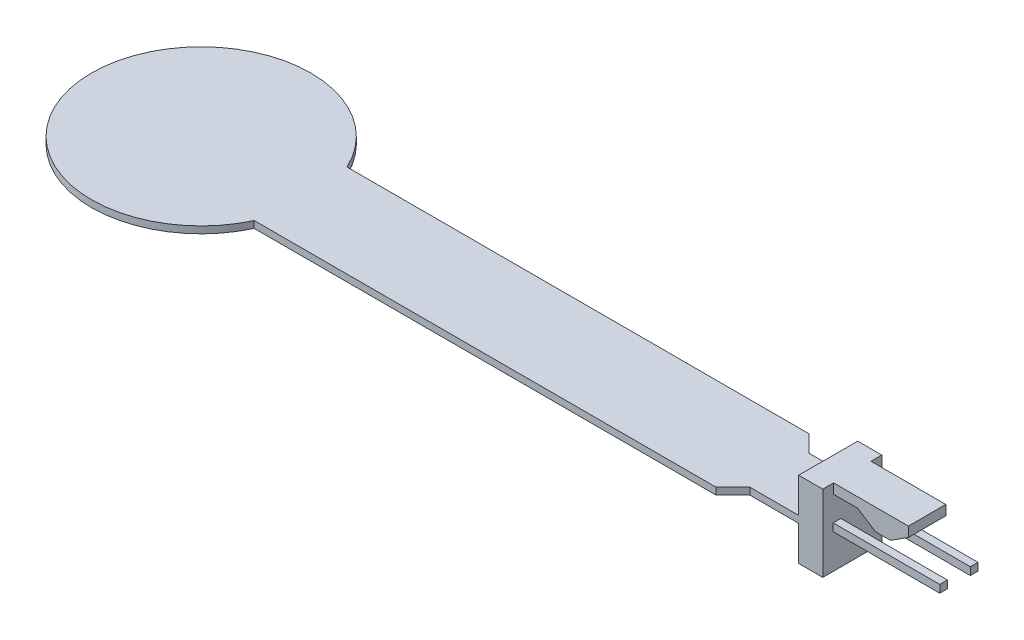
ISO-10303-21;
HEADER;
FILE_DESCRIPTION(('STEP AP214'),'2;1');
FILE_NAME('part.step','',(''),(''),'','','');
FILE_SCHEMA(('AUTOMOTIVE_DESIGN { 1 0 10303 214 1 1 1 1 }'));
ENDSEC;
DATA;
#1=APPLICATION_CONTEXT('core data for automotive mechanical design processes');
#2=APPLICATION_PROTOCOL_DEFINITION('international standard','automotive_design',2000,#1);
#3=PRODUCT_CONTEXT('',#1,'mechanical');
#4=PRODUCT('Part','Part','',(#3));
#5=PRODUCT_RELATED_PRODUCT_CATEGORY('part','',(#4));
#6=PRODUCT_DEFINITION_FORMATION('','',#4);
#7=PRODUCT_DEFINITION_CONTEXT('part definition',#1,'design');
#8=PRODUCT_DEFINITION('design','',#6,#7);
#9=PRODUCT_DEFINITION_SHAPE('','',#8);
#10=(LENGTH_UNIT() NAMED_UNIT(*) SI_UNIT(.MILLI.,.METRE.));
#11=(NAMED_UNIT(*) PLANE_ANGLE_UNIT() SI_UNIT($,.RADIAN.));
#12=(NAMED_UNIT(*) SI_UNIT($,.STERADIAN.) SOLID_ANGLE_UNIT());
#13=UNCERTAINTY_MEASURE_WITH_UNIT(LENGTH_MEASURE(1.E-05),#10,'distance_accuracy_value','');
#14=(GEOMETRIC_REPRESENTATION_CONTEXT(3) GLOBAL_UNCERTAINTY_ASSIGNED_CONTEXT((#13)) GLOBAL_UNIT_ASSIGNED_CONTEXT((#10,
#11,#12)) REPRESENTATION_CONTEXT('',''));
#15=CARTESIAN_POINT('',(0.,0.,0.));
#16=DIRECTION('',(0.,0.,1.));
#17=DIRECTION('',(1.,0.,0.));
#18=AXIS2_PLACEMENT_3D('',#15,#16,#17);
#19=CARTESIAN_POINT('',(54.06,0.,0.));
#20=DIRECTION('',(-1.,0.,0.));
#21=DIRECTION('',(0.,0.,1.));
#22=AXIS2_PLACEMENT_3D('',#19,#20,#21);
#23=PLANE('',#22);
#24=DIRECTION('',(0.,0.,-1.));
#25=VECTOR('',#24,1.);
#26=CARTESIAN_POINT('',(54.06,-0.3175,1.5875));
#27=LINE('',#26,#25);
#28=CARTESIAN_POINT('',(54.06,-0.3175,1.5875));
#29=VERTEX_POINT('',#28);
#30=CARTESIAN_POINT('',(54.06,-0.3175,0.9525));
#31=VERTEX_POINT('',#30);
#32=EDGE_CURVE('E266',#29,#31,#27,.T.);
#33=ORIENTED_EDGE('',*,*,#32,.F.);
#34=DIRECTION('',(0.,-1.,0.));
#35=VECTOR('',#34,1.);
#36=CARTESIAN_POINT('',(54.06,-0.3175,1.5875));
#37=LINE('',#36,#35);
#38=CARTESIAN_POINT('',(54.06,0.317500000000001,1.5875));
#39=VERTEX_POINT('',#38);
#40=EDGE_CURVE('E263',#39,#29,#37,.T.);
#41=ORIENTED_EDGE('',*,*,#40,.F.);
#42=DIRECTION('',(0.,0.,1.));
#43=VECTOR('',#42,1.);
#44=CARTESIAN_POINT('',(54.06,0.317500000000001,1.5875));
#45=LINE('',#44,#43);
#46=CARTESIAN_POINT('',(54.06,0.317500000000001,0.9525));
#47=VERTEX_POINT('',#46);
#48=EDGE_CURVE('E260',#47,#39,#45,.T.);
#49=ORIENTED_EDGE('',*,*,#48,.F.);
#50=DIRECTION('',(0.,1.,0.));
#51=VECTOR('',#50,1.);
#52=CARTESIAN_POINT('',(54.06,-0.3175,0.9525));
#53=LINE('',#52,#51);
#54=EDGE_CURVE('E257',#31,#47,#53,.T.);
#55=ORIENTED_EDGE('',*,*,#54,.F.);
#56=EDGE_LOOP('',(#33,#41,#49,#55));
#57=FACE_BOUND('',#56,.T.);
#58=DIRECTION('',(0.,0.,1.));
#59=VECTOR('',#58,1.);
#60=CARTESIAN_POINT('',(54.06,3.175,2.45));
#61=LINE('',#60,#59);
#62=CARTESIAN_POINT('',(54.06,3.175,-2.45));
#63=VERTEX_POINT('',#62);
#64=CARTESIAN_POINT('',(54.06,3.175,-1.555));
#65=VERTEX_POINT('',#64);
#66=EDGE_CURVE('E341',#63,#65,#61,.T.);
#67=ORIENTED_EDGE('',*,*,#66,.T.);
#68=DIRECTION('',(0.,-1.,0.));
#69=VECTOR('',#68,1.);
#70=CARTESIAN_POINT('',(54.06,2.355,-1.555));
#71=LINE('',#70,#69);
#72=CARTESIAN_POINT('',(54.06,2.355,-1.555));
#73=VERTEX_POINT('',#72);
#74=EDGE_CURVE('E256',#65,#73,#71,.T.);
#75=ORIENTED_EDGE('',*,*,#74,.T.);
#76=DIRECTION('',(0.,0.,-1.));
#77=VECTOR('',#76,1.);
#78=CARTESIAN_POINT('',(54.06,2.355,1.555));
#79=LINE('',#78,#77);
#80=CARTESIAN_POINT('',(54.06,2.355,1.555));
#81=VERTEX_POINT('',#80);
#82=EDGE_CURVE('E328',#81,#73,#79,.T.);
#83=ORIENTED_EDGE('',*,*,#82,.F.);
#84=DIRECTION('',(0.,-1.,0.));
#85=VECTOR('',#84,1.);
#86=CARTESIAN_POINT('',(54.06,2.355,1.555));
#87=LINE('',#86,#85);
#88=CARTESIAN_POINT('',(54.06,3.175,1.555));
#89=VERTEX_POINT('',#88);
#90=EDGE_CURVE('E283',#89,#81,#87,.T.);
#91=ORIENTED_EDGE('',*,*,#90,.F.);
#92=CARTESIAN_POINT('',(54.06,3.175,2.45));
#93=VERTEX_POINT('',#92);
#94=EDGE_CURVE('E340',#89,#93,#61,.T.);
#95=ORIENTED_EDGE('',*,*,#94,.T.);
#96=DIRECTION('',(0.,-1.,0.));
#97=VECTOR('',#96,1.);
#98=CARTESIAN_POINT('',(54.06,-3.175,2.45));
#99=LINE('',#98,#97);
#100=CARTESIAN_POINT('',(54.06,-3.175,2.45));
#101=VERTEX_POINT('',#100);
#102=EDGE_CURVE('E332',#93,#101,#99,.T.);
#103=ORIENTED_EDGE('',*,*,#102,.T.);
#104=DIRECTION('',(0.,0.,-1.));
#105=VECTOR('',#104,1.);
#106=CARTESIAN_POINT('',(54.06,-3.175,2.45));
#107=LINE('',#106,#105);
#108=CARTESIAN_POINT('',(54.06,-3.175,-2.45));
#109=VERTEX_POINT('',#108);
#110=EDGE_CURVE('E335',#101,#109,#107,.T.);
#111=ORIENTED_EDGE('',*,*,#110,.T.);
#112=DIRECTION('',(0.,1.,0.));
#113=VECTOR('',#112,1.);
#114=CARTESIAN_POINT('',(54.06,-3.175,-2.45));
#115=LINE('',#114,#113);
#116=EDGE_CURVE('E338',#109,#63,#115,.T.);
#117=ORIENTED_EDGE('',*,*,#116,.T.);
#118=EDGE_LOOP('',(#67,#75,#83,#91,#95,#103,#111,#117));
#119=FACE_BOUND('',#118,.T.);
#120=DIRECTION('',(0.,0.,-1.));
#121=VECTOR('',#120,1.);
#122=CARTESIAN_POINT('',(54.06,-0.3175,-0.9525));
#123=LINE('',#122,#121);
#124=CARTESIAN_POINT('',(54.06,-0.3175,-0.9525));
#125=VERTEX_POINT('',#124);
#126=CARTESIAN_POINT('',(54.06,-0.317499999999999,-1.5875));
#127=VERTEX_POINT('',#126);
#128=EDGE_CURVE('E50',#125,#127,#123,.T.);
#129=ORIENTED_EDGE('',*,*,#128,.F.);
#130=DIRECTION('',(0.,-1.,0.));
#131=VECTOR('',#130,1.);
#132=CARTESIAN_POINT('',(54.06,-0.3175,-0.9525));
#133=LINE('',#132,#131);
#134=CARTESIAN_POINT('',(54.06,0.317500000000001,-0.9525));
#135=VERTEX_POINT('',#134);
#136=EDGE_CURVE('E55',#135,#125,#133,.T.);
#137=ORIENTED_EDGE('',*,*,#136,.F.);
#138=DIRECTION('',(0.,0.,1.));
#139=VECTOR('',#138,1.);
#140=CARTESIAN_POINT('',(54.06,0.317500000000001,-0.9525));
#141=LINE('',#140,#139);
#142=CARTESIAN_POINT('',(54.06,0.317500000000001,-1.5875));
#143=VERTEX_POINT('',#142);
#144=EDGE_CURVE('E211',#143,#135,#141,.T.);
#145=ORIENTED_EDGE('',*,*,#144,.F.);
#146=DIRECTION('',(0.,1.,0.));
#147=VECTOR('',#146,1.);
#148=CARTESIAN_POINT('',(54.06,-0.317499999999999,-1.5875));
#149=LINE('',#148,#147);
#150=EDGE_CURVE('E214',#127,#143,#149,.T.);
#151=ORIENTED_EDGE('',*,*,#150,.F.);
#152=EDGE_LOOP('',(#129,#137,#145,#151));
#153=FACE_BOUND('',#152,.T.);
#154=ADVANCED_FACE('F35',(#57,#119,#153),#23,.F.);
#155=CARTESIAN_POINT('',(0.,0.285,0.));
#156=DIRECTION('',(0.,-1.,0.));
#157=DIRECTION('',(0.,0.,-1.));
#158=AXIS2_PLACEMENT_3D('',#155,#156,#157);
#159=CYLINDRICAL_SURFACE('',#158,9.11);
#160=CARTESIAN_POINT('',(0.,-0.285,0.));
#161=DIRECTION('',(0.,1.,0.));
#162=DIRECTION('',(0.,0.,1.));
#163=AXIS2_PLACEMENT_3D('',#160,#161,#162);
#164=CIRCLE('',#163,9.11);
#165=CARTESIAN_POINT('',(8.25648835764939,-0.285,-3.85));
#166=VERTEX_POINT('',#165);
#167=CARTESIAN_POINT('',(8.25648835764939,-0.285,3.85));
#168=VERTEX_POINT('',#167);
#169=EDGE_CURVE('E365',#166,#168,#164,.T.);
#170=ORIENTED_EDGE('',*,*,#169,.T.);
#171=DIRECTION('',(0.,-1.,0.));
#172=VECTOR('',#171,1.);
#173=CARTESIAN_POINT('',(8.25648835764939,0.285,3.85));
#174=LINE('',#173,#172);
#175=CARTESIAN_POINT('',(8.25648835764939,0.285,3.85));
#176=VERTEX_POINT('',#175);
#177=EDGE_CURVE('E12',#176,#168,#174,.T.);
#178=ORIENTED_EDGE('',*,*,#177,.F.);
#179=CARTESIAN_POINT('',(0.,0.285,0.));
#180=DIRECTION('',(0.,1.,0.));
#181=DIRECTION('',(0.,0.,1.));
#182=AXIS2_PLACEMENT_3D('',#179,#180,#181);
#183=CIRCLE('',#182,9.11);
#184=CARTESIAN_POINT('',(8.25648835764939,0.285,-3.85));
#185=VERTEX_POINT('',#184);
#186=EDGE_CURVE('E366',#185,#176,#183,.T.);
#187=ORIENTED_EDGE('',*,*,#186,.F.);
#188=DIRECTION('',(0.,-1.,0.));
#189=VECTOR('',#188,1.);
#190=CARTESIAN_POINT('',(8.25648835764939,0.285,-3.85));
#191=LINE('',#190,#189);
#192=EDGE_CURVE('E386',#185,#166,#191,.T.);
#193=ORIENTED_EDGE('',*,*,#192,.T.);
#194=EDGE_LOOP('',(#170,#178,#187,#193));
#195=FACE_BOUND('',#194,.T.);
#196=ADVANCED_FACE('F37',(#195),#159,.T.);
#197=CARTESIAN_POINT('',(8.25648835764939,0.285,3.85));
#198=DIRECTION('',(0.,0.,-1.));
#199=DIRECTION('',(-1.,0.,0.));
#200=AXIS2_PLACEMENT_3D('',#197,#198,#199);
#201=PLANE('',#200);
#202=DIRECTION('',(1.,0.,0.));
#203=VECTOR('',#202,1.);
#204=CARTESIAN_POINT('',(8.25648835764939,-0.285,3.85));
#205=LINE('',#204,#203);
#206=CARTESIAN_POINT('',(46.5987585614697,-0.285,3.85));
#207=VERTEX_POINT('',#206);
#208=EDGE_CURVE('E389',#168,#207,#205,.T.);
#209=ORIENTED_EDGE('',*,*,#208,.T.);
#210=DIRECTION('',(0.,-1.,0.));
#211=VECTOR('',#210,1.);
#212=CARTESIAN_POINT('',(46.5987585614697,0.285,3.85));
#213=LINE('',#212,#211);
#214=CARTESIAN_POINT('',(46.5987585614697,0.285,3.85));
#215=VERTEX_POINT('',#214);
#216=EDGE_CURVE('E43',#215,#207,#213,.T.);
#217=ORIENTED_EDGE('',*,*,#216,.F.);
#218=DIRECTION('',(1.,0.,0.));
#219=VECTOR('',#218,1.);
#220=CARTESIAN_POINT('',(8.25648835764939,0.285,3.85));
#221=LINE('',#220,#219);
#222=EDGE_CURVE('E369',#176,#215,#221,.T.);
#223=ORIENTED_EDGE('',*,*,#222,.F.);
#224=ORIENTED_EDGE('',*,*,#177,.T.);
#225=EDGE_LOOP('',(#209,#217,#223,#224));
#226=FACE_BOUND('',#225,.T.);
#227=ADVANCED_FACE('F438',(#226),#201,.F.);
#228=CARTESIAN_POINT('',(47.9987585614696,0.285,2.45));
#229=DIRECTION('',(-0.707106781186548,0.,-0.707106781186547));
#230=DIRECTION('',(-0.707106781186547,0.,0.707106781186548));
#231=AXIS2_PLACEMENT_3D('',#228,#229,#230);
#232=PLANE('',#231);
#233=DIRECTION('',(0.707106781186547,0.,-0.707106781186548));
#234=VECTOR('',#233,1.);
#235=CARTESIAN_POINT('',(47.9987585614696,-0.285,2.45));
#236=LINE('',#235,#234);
#237=CARTESIAN_POINT('',(47.9987585614696,-0.285,2.45));
#238=VERTEX_POINT('',#237);
#239=EDGE_CURVE('E391',#207,#238,#236,.T.);
#240=ORIENTED_EDGE('',*,*,#239,.T.);
#241=DIRECTION('',(0.,-1.,0.));
#242=VECTOR('',#241,1.);
#243=CARTESIAN_POINT('',(47.9987585614696,0.285,2.45));
#244=LINE('',#243,#242);
#245=CARTESIAN_POINT('',(47.9987585614696,0.285,2.45));
#246=VERTEX_POINT('',#245);
#247=EDGE_CURVE('E411',#246,#238,#244,.T.);
#248=ORIENTED_EDGE('',*,*,#247,.F.);
#249=DIRECTION('',(0.707106781186547,0.,-0.707106781186548));
#250=VECTOR('',#249,1.);
#251=CARTESIAN_POINT('',(47.9987585614696,0.285,2.45));
#252=LINE('',#251,#250);
#253=EDGE_CURVE('E372',#215,#246,#252,.T.);
#254=ORIENTED_EDGE('',*,*,#253,.F.);
#255=ORIENTED_EDGE('',*,*,#216,.T.);
#256=EDGE_LOOP('',(#240,#248,#254,#255));
#257=FACE_BOUND('',#256,.T.);
#258=ADVANCED_FACE('F418',(#257),#232,.F.);
#259=CARTESIAN_POINT('',(52.06,0.285,2.45));
#260=DIRECTION('',(0.,0.,-1.));
#261=DIRECTION('',(-1.,0.,0.));
#262=AXIS2_PLACEMENT_3D('',#259,#260,#261);
#263=PLANE('',#262);
#264=DIRECTION('',(1.,0.,0.));
#265=VECTOR('',#264,1.);
#266=CARTESIAN_POINT('',(52.06,-0.285,2.45));
#267=LINE('',#266,#265);
#268=CARTESIAN_POINT('',(52.06,-0.285,2.45));
#269=VERTEX_POINT('',#268);
#270=EDGE_CURVE('E393',#238,#269,#267,.T.);
#271=ORIENTED_EDGE('',*,*,#270,.T.);
#272=DIRECTION('',(0.,-1.,0.));
#273=VECTOR('',#272,1.);
#274=CARTESIAN_POINT('',(52.06,-3.175,2.45));
#275=LINE('',#274,#273);
#276=CARTESIAN_POINT('',(52.06,-3.175,2.45));
#277=VERTEX_POINT('',#276);
#278=EDGE_CURVE('E331',#269,#277,#275,.T.);
#279=ORIENTED_EDGE('',*,*,#278,.T.);
#280=DIRECTION('',(-1.,0.,0.));
#281=VECTOR('',#280,1.);
#282=CARTESIAN_POINT('',(54.06,-3.175,2.45));
#283=LINE('',#282,#281);
#284=EDGE_CURVE('E362',#101,#277,#283,.T.);
#285=ORIENTED_EDGE('',*,*,#284,.F.);
#286=ORIENTED_EDGE('',*,*,#102,.F.);
#287=DIRECTION('',(-1.,0.,0.));
#288=VECTOR('',#287,1.);
#289=CARTESIAN_POINT('',(54.06,3.175,2.45));
#290=LINE('',#289,#288);
#291=CARTESIAN_POINT('',(52.06,3.175,2.45));
#292=VERTEX_POINT('',#291);
#293=EDGE_CURVE('E343',#93,#292,#290,.T.);
#294=ORIENTED_EDGE('',*,*,#293,.T.);
#295=CARTESIAN_POINT('',(52.06,0.285,2.45));
#296=VERTEX_POINT('',#295);
#297=EDGE_CURVE('E344',#292,#296,#275,.T.);
#298=ORIENTED_EDGE('',*,*,#297,.T.);
#299=DIRECTION('',(1.,0.,0.));
#300=VECTOR('',#299,1.);
#301=CARTESIAN_POINT('',(52.06,0.285,2.45));
#302=LINE('',#301,#300);
#303=EDGE_CURVE('E374',#246,#296,#302,.T.);
#304=ORIENTED_EDGE('',*,*,#303,.F.);
#305=ORIENTED_EDGE('',*,*,#247,.T.);
#306=EDGE_LOOP('',(#271,#279,#285,#286,#294,#298,#304,#305));
#307=FACE_BOUND('',#306,.T.);
#308=ADVANCED_FACE('F428',(#307),#263,.F.);
#309=CARTESIAN_POINT('',(47.9987585614696,0.285,-2.45));
#310=DIRECTION('',(0.,0.,1.));
#311=DIRECTION('',(1.,0.,0.));
#312=AXIS2_PLACEMENT_3D('',#309,#310,#311);
#313=PLANE('',#312);
#314=DIRECTION('',(-1.,0.,0.));
#315=VECTOR('',#314,1.);
#316=CARTESIAN_POINT('',(47.9987585614696,-0.285,-2.45));
#317=LINE('',#316,#315);
#318=CARTESIAN_POINT('',(52.06,-0.285,-2.45));
#319=VERTEX_POINT('',#318);
#320=CARTESIAN_POINT('',(47.9987585614696,-0.285,-2.45));
#321=VERTEX_POINT('',#320);
#322=EDGE_CURVE('E398',#319,#321,#317,.T.);
#323=ORIENTED_EDGE('',*,*,#322,.T.);
#324=DIRECTION('',(0.,-1.,0.));
#325=VECTOR('',#324,1.);
#326=CARTESIAN_POINT('',(47.9987585614696,0.285,-2.45));
#327=LINE('',#326,#325);
#328=CARTESIAN_POINT('',(47.9987585614696,0.285,-2.45));
#329=VERTEX_POINT('',#328);
#330=EDGE_CURVE('E408',#329,#321,#327,.T.);
#331=ORIENTED_EDGE('',*,*,#330,.F.);
#332=DIRECTION('',(-1.,0.,0.));
#333=VECTOR('',#332,1.);
#334=CARTESIAN_POINT('',(47.9987585614696,0.285,-2.45));
#335=LINE('',#334,#333);
#336=CARTESIAN_POINT('',(52.06,0.285,-2.45));
#337=VERTEX_POINT('',#336);
#338=EDGE_CURVE('E380',#337,#329,#335,.T.);
#339=ORIENTED_EDGE('',*,*,#338,.F.);
#340=DIRECTION('',(0.,1.,0.));
#341=VECTOR('',#340,1.);
#342=CARTESIAN_POINT('',(52.06,-3.175,-2.45));
#343=LINE('',#342,#341);
#344=CARTESIAN_POINT('',(52.06,3.175,-2.45));
#345=VERTEX_POINT('',#344);
#346=EDGE_CURVE('E349',#337,#345,#343,.T.);
#347=ORIENTED_EDGE('',*,*,#346,.T.);
#348=DIRECTION('',(-1.,0.,0.));
#349=VECTOR('',#348,1.);
#350=CARTESIAN_POINT('',(54.06,3.175,-2.45));
#351=LINE('',#350,#349);
#352=EDGE_CURVE('E356',#63,#345,#351,.T.);
#353=ORIENTED_EDGE('',*,*,#352,.F.);
#354=ORIENTED_EDGE('',*,*,#116,.F.);
#355=DIRECTION('',(-1.,0.,0.));
#356=VECTOR('',#355,1.);
#357=CARTESIAN_POINT('',(54.06,-3.175,-2.45));
#358=LINE('',#357,#356);
#359=CARTESIAN_POINT('',(52.06,-3.175,-2.45));
#360=VERTEX_POINT('',#359);
#361=EDGE_CURVE('E359',#109,#360,#358,.T.);
#362=ORIENTED_EDGE('',*,*,#361,.T.);
#363=EDGE_CURVE('E350',#360,#319,#343,.T.);
#364=ORIENTED_EDGE('',*,*,#363,.T.);
#365=EDGE_LOOP('',(#323,#331,#339,#347,#353,#354,#362,#364));
#366=FACE_BOUND('',#365,.T.);
#367=ADVANCED_FACE('F452',(#366),#313,.F.);
#368=CARTESIAN_POINT('',(46.5987585614697,0.285,-3.85));
#369=DIRECTION('',(-0.707106781186548,0.,0.707106781186547));
#370=DIRECTION('',(0.707106781186547,0.,0.707106781186548));
#371=AXIS2_PLACEMENT_3D('',#368,#369,#370);
#372=PLANE('',#371);
#373=DIRECTION('',(-0.707106781186547,0.,-0.707106781186548));
#374=VECTOR('',#373,1.);
#375=CARTESIAN_POINT('',(46.5987585614697,-0.285,-3.85));
#376=LINE('',#375,#374);
#377=CARTESIAN_POINT('',(46.5987585614697,-0.285,-3.85));
#378=VERTEX_POINT('',#377);
#379=EDGE_CURVE('E400',#321,#378,#376,.T.);
#380=ORIENTED_EDGE('',*,*,#379,.T.);
#381=DIRECTION('',(0.,-1.,0.));
#382=VECTOR('',#381,1.);
#383=CARTESIAN_POINT('',(46.5987585614697,0.285,-3.85));
#384=LINE('',#383,#382);
#385=CARTESIAN_POINT('',(46.5987585614697,0.285,-3.85));
#386=VERTEX_POINT('',#385);
#387=EDGE_CURVE('E405',#386,#378,#384,.T.);
#388=ORIENTED_EDGE('',*,*,#387,.F.);
#389=DIRECTION('',(-0.707106781186547,0.,-0.707106781186548));
#390=VECTOR('',#389,1.);
#391=CARTESIAN_POINT('',(46.5987585614697,0.285,-3.85));
#392=LINE('',#391,#390);
#393=EDGE_CURVE('E382',#329,#386,#392,.T.);
#394=ORIENTED_EDGE('',*,*,#393,.F.);
#395=ORIENTED_EDGE('',*,*,#330,.T.);
#396=EDGE_LOOP('',(#380,#388,#394,#395));
#397=FACE_BOUND('',#396,.T.);
#398=ADVANCED_FACE('F449',(#397),#372,.F.);
#399=CARTESIAN_POINT('',(8.25648835764939,0.285,-3.85));
#400=DIRECTION('',(0.,0.,1.));
#401=DIRECTION('',(1.,0.,0.));
#402=AXIS2_PLACEMENT_3D('',#399,#400,#401);
#403=PLANE('',#402);
#404=DIRECTION('',(-1.,0.,0.));
#405=VECTOR('',#404,1.);
#406=CARTESIAN_POINT('',(8.25648835764939,-0.285,-3.85));
#407=LINE('',#406,#405);
#408=EDGE_CURVE('E370',#378,#166,#407,.T.);
#409=ORIENTED_EDGE('',*,*,#408,.T.);
#410=ORIENTED_EDGE('',*,*,#192,.F.);
#411=DIRECTION('',(-1.,0.,0.));
#412=VECTOR('',#411,1.);
#413=CARTESIAN_POINT('',(8.25648835764939,0.285,-3.85));
#414=LINE('',#413,#412);
#415=EDGE_CURVE('E384',#386,#185,#414,.T.);
#416=ORIENTED_EDGE('',*,*,#415,.F.);
#417=ORIENTED_EDGE('',*,*,#387,.T.);
#418=EDGE_LOOP('',(#409,#410,#416,#417));
#419=FACE_BOUND('',#418,.T.);
#420=ADVANCED_FACE('F444',(#419),#403,.F.);
#421=CARTESIAN_POINT('',(0.,0.285,0.));
#422=DIRECTION('',(0.,1.,0.));
#423=DIRECTION('',(0.,0.,1.));
#424=AXIS2_PLACEMENT_3D('',#421,#422,#423);
#425=PLANE('',#424);
#426=ORIENTED_EDGE('',*,*,#186,.T.);
#427=ORIENTED_EDGE('',*,*,#222,.T.);
#428=ORIENTED_EDGE('',*,*,#253,.T.);
#429=ORIENTED_EDGE('',*,*,#303,.T.);
#430=DIRECTION('',(0.,0.,-1.));
#431=VECTOR('',#430,1.);
#432=CARTESIAN_POINT('',(52.06,0.285,-2.45));
#433=LINE('',#432,#431);
#434=EDGE_CURVE('E377',#296,#337,#433,.T.);
#435=ORIENTED_EDGE('',*,*,#434,.T.);
#436=ORIENTED_EDGE('',*,*,#338,.T.);
#437=ORIENTED_EDGE('',*,*,#393,.T.);
#438=ORIENTED_EDGE('',*,*,#415,.T.);
#439=EDGE_LOOP('',(#426,#427,#428,#429,#435,#436,#437,#438));
#440=FACE_BOUND('',#439,.T.);
#441=ADVANCED_FACE('F434',(#440),#425,.T.);
#442=CARTESIAN_POINT('',(0.,-0.285,0.));
#443=DIRECTION('',(0.,1.,0.));
#444=DIRECTION('',(0.,0.,1.));
#445=AXIS2_PLACEMENT_3D('',#442,#443,#444);
#446=PLANE('',#445);
#447=ORIENTED_EDGE('',*,*,#169,.F.);
#448=ORIENTED_EDGE('',*,*,#408,.F.);
#449=ORIENTED_EDGE('',*,*,#379,.F.);
#450=ORIENTED_EDGE('',*,*,#322,.F.);
#451=DIRECTION('',(0.,0.,-1.));
#452=VECTOR('',#451,1.);
#453=CARTESIAN_POINT('',(52.06,-0.285,-2.45));
#454=LINE('',#453,#452);
#455=EDGE_CURVE('E396',#269,#319,#454,.T.);
#456=ORIENTED_EDGE('',*,*,#455,.F.);
#457=ORIENTED_EDGE('',*,*,#270,.F.);
#458=ORIENTED_EDGE('',*,*,#239,.F.);
#459=ORIENTED_EDGE('',*,*,#208,.F.);
#460=EDGE_LOOP('',(#447,#448,#449,#450,#456,#457,#458,#459));
#461=FACE_BOUND('',#460,.T.);
#462=ADVANCED_FACE('F424',(#461),#446,.F.);
#463=CARTESIAN_POINT('',(52.06,0.,0.));
#464=DIRECTION('',(-1.,0.,0.));
#465=DIRECTION('',(0.,0.,1.));
#466=AXIS2_PLACEMENT_3D('',#463,#464,#465);
#467=PLANE('',#466);
#468=ORIENTED_EDGE('',*,*,#434,.F.);
#469=ORIENTED_EDGE('',*,*,#297,.F.);
#470=DIRECTION('',(0.,0.,1.));
#471=VECTOR('',#470,1.);
#472=CARTESIAN_POINT('',(52.06,3.175,2.45));
#473=LINE('',#472,#471);
#474=EDGE_CURVE('E336',#345,#292,#473,.T.);
#475=ORIENTED_EDGE('',*,*,#474,.F.);
#476=ORIENTED_EDGE('',*,*,#346,.F.);
#477=EDGE_LOOP('',(#468,#469,#475,#476));
#478=FACE_BOUND('',#477,.T.);
#479=ADVANCED_FACE('F471',(#478),#467,.T.);
#480=CARTESIAN_POINT('',(54.06,-3.175,2.45));
#481=DIRECTION('',(0.,1.,0.));
#482=DIRECTION('',(0.,0.,1.));
#483=AXIS2_PLACEMENT_3D('',#480,#481,#482);
#484=PLANE('',#483);
#485=DIRECTION('',(0.,0.,-1.));
#486=VECTOR('',#485,1.);
#487=CARTESIAN_POINT('',(52.06,-3.175,2.45));
#488=LINE('',#487,#486);
#489=EDGE_CURVE('E347',#277,#360,#488,.T.);
#490=ORIENTED_EDGE('',*,*,#489,.T.);
#491=ORIENTED_EDGE('',*,*,#361,.F.);
#492=ORIENTED_EDGE('',*,*,#110,.F.);
#493=ORIENTED_EDGE('',*,*,#284,.T.);
#494=EDGE_LOOP('',(#490,#491,#492,#493));
#495=FACE_BOUND('',#494,.T.);
#496=ADVANCED_FACE('F459',(#495),#484,.F.);
#497=CARTESIAN_POINT('',(54.06,3.175,2.45));
#498=DIRECTION('',(0.,-1.,0.));
#499=DIRECTION('',(0.,0.,-1.));
#500=AXIS2_PLACEMENT_3D('',#497,#498,#499);
#501=PLANE('',#500);
#502=ORIENTED_EDGE('',*,*,#474,.T.);
#503=ORIENTED_EDGE('',*,*,#293,.F.);
#504=ORIENTED_EDGE('',*,*,#94,.F.);
#505=DIRECTION('',(-1.,0.,0.));
#506=VECTOR('',#505,1.);
#507=CARTESIAN_POINT('',(54.06,3.175,1.555));
#508=LINE('',#507,#506);
#509=CARTESIAN_POINT('',(60.27,3.175,1.555));
#510=VERTEX_POINT('',#509);
#511=EDGE_CURVE('E297',#510,#89,#508,.T.);
#512=ORIENTED_EDGE('',*,*,#511,.F.);
#513=DIRECTION('',(0.,0.,-1.));
#514=VECTOR('',#513,1.);
#515=CARTESIAN_POINT('',(60.27,3.175,1.555));
#516=LINE('',#515,#514);
#517=CARTESIAN_POINT('',(60.27,3.175,-1.555));
#518=VERTEX_POINT('',#517);
#519=EDGE_CURVE('E300',#510,#518,#516,.T.);
#520=ORIENTED_EDGE('',*,*,#519,.T.);
#521=DIRECTION('',(-1.,0.,0.));
#522=VECTOR('',#521,1.);
#523=CARTESIAN_POINT('',(54.06,3.175,-1.555));
#524=LINE('',#523,#522);
#525=EDGE_CURVE('E287',#518,#65,#524,.T.);
#526=ORIENTED_EDGE('',*,*,#525,.T.);
#527=ORIENTED_EDGE('',*,*,#66,.F.);
#528=ORIENTED_EDGE('',*,*,#352,.T.);
#529=EDGE_LOOP('',(#502,#503,#504,#512,#520,#526,#527,#528));
#530=FACE_BOUND('',#529,.T.);
#531=ADVANCED_FACE('F466',(#530),#501,.F.);
#532=ORIENTED_EDGE('',*,*,#278,.F.);
#533=ORIENTED_EDGE('',*,*,#455,.T.);
#534=ORIENTED_EDGE('',*,*,#363,.F.);
#535=ORIENTED_EDGE('',*,*,#489,.F.);
#536=EDGE_LOOP('',(#532,#533,#534,#535));
#537=FACE_BOUND('',#536,.T.);
#538=ADVANCED_FACE('F457',(#537),#467,.T.);
#539=CARTESIAN_POINT('',(56.06,2.355,1.555));
#540=DIRECTION('',(0.,1.,0.));
#541=DIRECTION('',(0.,0.,1.));
#542=AXIS2_PLACEMENT_3D('',#539,#540,#541);
#543=PLANE('',#542);
#544=DIRECTION('',(1.,0.,0.));
#545=VECTOR('',#544,1.);
#546=CARTESIAN_POINT('',(56.06,2.355,-1.555));
#547=LINE('',#546,#545);
#548=CARTESIAN_POINT('',(56.06,2.355,-1.555));
#549=VERTEX_POINT('',#548);
#550=EDGE_CURVE('E302',#73,#549,#547,.T.);
#551=ORIENTED_EDGE('',*,*,#550,.T.);
#552=DIRECTION('',(0.,0.,-1.));
#553=VECTOR('',#552,1.);
#554=CARTESIAN_POINT('',(56.06,2.355,1.555));
#555=LINE('',#554,#553);
#556=CARTESIAN_POINT('',(56.06,2.355,1.555));
#557=VERTEX_POINT('',#556);
#558=EDGE_CURVE('E325',#557,#549,#555,.T.);
#559=ORIENTED_EDGE('',*,*,#558,.F.);
#560=DIRECTION('',(1.,0.,0.));
#561=VECTOR('',#560,1.);
#562=CARTESIAN_POINT('',(56.06,2.355,1.555));
#563=LINE('',#562,#561);
#564=EDGE_CURVE('E286',#81,#557,#563,.T.);
#565=ORIENTED_EDGE('',*,*,#564,.F.);
#566=ORIENTED_EDGE('',*,*,#82,.T.);
#567=EDGE_LOOP('',(#551,#559,#565,#566));
#568=FACE_BOUND('',#567,.T.);
#569=ADVANCED_FACE('F482',(#568),#543,.F.);
#570=CARTESIAN_POINT('',(57.54,1.405,1.555));
#571=DIRECTION('',(0.540182693447417,0.841547775054924,0.));
#572=DIRECTION('',(-0.841547775054925,0.540182693447417,0.));
#573=AXIS2_PLACEMENT_3D('',#570,#571,#572);
#574=PLANE('',#573);
#575=DIRECTION('',(0.841547775054925,-0.540182693447417,0.));
#576=VECTOR('',#575,1.);
#577=CARTESIAN_POINT('',(57.54,1.405,-1.555));
#578=LINE('',#577,#576);
#579=CARTESIAN_POINT('',(57.54,1.405,-1.555));
#580=VERTEX_POINT('',#579);
#581=EDGE_CURVE('E304',#549,#580,#578,.T.);
#582=ORIENTED_EDGE('',*,*,#581,.T.);
#583=DIRECTION('',(0.,0.,-1.));
#584=VECTOR('',#583,1.);
#585=CARTESIAN_POINT('',(57.54,1.405,1.555));
#586=LINE('',#585,#584);
#587=CARTESIAN_POINT('',(57.54,1.405,1.555));
#588=VERTEX_POINT('',#587);
#589=EDGE_CURVE('E322',#588,#580,#586,.T.);
#590=ORIENTED_EDGE('',*,*,#589,.F.);
#591=DIRECTION('',(0.841547775054925,-0.540182693447417,0.));
#592=VECTOR('',#591,1.);
#593=CARTESIAN_POINT('',(57.54,1.405,1.555));
#594=LINE('',#593,#592);
#595=EDGE_CURVE('E289',#557,#588,#594,.T.);
#596=ORIENTED_EDGE('',*,*,#595,.F.);
#597=ORIENTED_EDGE('',*,*,#558,.T.);
#598=EDGE_LOOP('',(#582,#590,#596,#597));
#599=FACE_BOUND('',#598,.T.);
#600=ADVANCED_FACE('F502',(#599),#574,.F.);
#601=CARTESIAN_POINT('',(58.79,1.405,1.555));
#602=DIRECTION('',(0.,1.,0.));
#603=DIRECTION('',(0.,0.,1.));
#604=AXIS2_PLACEMENT_3D('',#601,#602,#603);
#605=PLANE('',#604);
#606=DIRECTION('',(1.,0.,0.));
#607=VECTOR('',#606,1.);
#608=CARTESIAN_POINT('',(58.79,1.405,-1.555));
#609=LINE('',#608,#607);
#610=CARTESIAN_POINT('',(58.79,1.405,-1.555));
#611=VERTEX_POINT('',#610);
#612=EDGE_CURVE('E306',#580,#611,#609,.T.);
#613=ORIENTED_EDGE('',*,*,#612,.T.);
#614=DIRECTION('',(0.,0.,-1.));
#615=VECTOR('',#614,1.);
#616=CARTESIAN_POINT('',(58.79,1.405,1.555));
#617=LINE('',#616,#615);
#618=CARTESIAN_POINT('',(58.79,1.405,1.555));
#619=VERTEX_POINT('',#618);
#620=EDGE_CURVE('E319',#619,#611,#617,.T.);
#621=ORIENTED_EDGE('',*,*,#620,.F.);
#622=DIRECTION('',(1.,0.,0.));
#623=VECTOR('',#622,1.);
#624=CARTESIAN_POINT('',(58.79,1.405,1.555));
#625=LINE('',#624,#623);
#626=EDGE_CURVE('E291',#588,#619,#625,.T.);
#627=ORIENTED_EDGE('',*,*,#626,.F.);
#628=ORIENTED_EDGE('',*,*,#589,.T.);
#629=EDGE_LOOP('',(#613,#621,#627,#628));
#630=FACE_BOUND('',#629,.T.);
#631=ADVANCED_FACE('F499',(#630),#605,.F.);
#632=CARTESIAN_POINT('',(60.27,2.355,1.555));
#633=DIRECTION('',(-0.540182693447419,0.841547775054923,0.));
#634=DIRECTION('',(-0.841547775054923,-0.540182693447419,0.));
#635=AXIS2_PLACEMENT_3D('',#632,#633,#634);
#636=PLANE('',#635);
#637=DIRECTION('',(0.841547775054923,0.540182693447419,0.));
#638=VECTOR('',#637,1.);
#639=CARTESIAN_POINT('',(60.27,2.355,-1.555));
#640=LINE('',#639,#638);
#641=CARTESIAN_POINT('',(60.27,2.355,-1.555));
#642=VERTEX_POINT('',#641);
#643=EDGE_CURVE('E308',#611,#642,#640,.T.);
#644=ORIENTED_EDGE('',*,*,#643,.T.);
#645=DIRECTION('',(0.,0.,-1.));
#646=VECTOR('',#645,1.);
#647=CARTESIAN_POINT('',(60.27,2.355,1.555));
#648=LINE('',#647,#646);
#649=CARTESIAN_POINT('',(60.27,2.355,1.555));
#650=VERTEX_POINT('',#649);
#651=EDGE_CURVE('E316',#650,#642,#648,.T.);
#652=ORIENTED_EDGE('',*,*,#651,.F.);
#653=DIRECTION('',(0.841547775054923,0.540182693447419,0.));
#654=VECTOR('',#653,1.);
#655=CARTESIAN_POINT('',(60.27,2.355,1.555));
#656=LINE('',#655,#654);
#657=EDGE_CURVE('E293',#619,#650,#656,.T.);
#658=ORIENTED_EDGE('',*,*,#657,.F.);
#659=ORIENTED_EDGE('',*,*,#620,.T.);
#660=EDGE_LOOP('',(#644,#652,#658,#659));
#661=FACE_BOUND('',#660,.T.);
#662=ADVANCED_FACE('F495',(#661),#636,.F.);
#663=CARTESIAN_POINT('',(60.27,3.175,1.555));
#664=DIRECTION('',(-1.,0.,0.));
#665=DIRECTION('',(0.,0.,1.));
#666=AXIS2_PLACEMENT_3D('',#663,#664,#665);
#667=PLANE('',#666);
#668=DIRECTION('',(0.,1.,0.));
#669=VECTOR('',#668,1.);
#670=CARTESIAN_POINT('',(60.27,3.175,-1.555));
#671=LINE('',#670,#669);
#672=EDGE_CURVE('E310',#642,#518,#671,.T.);
#673=ORIENTED_EDGE('',*,*,#672,.T.);
#674=ORIENTED_EDGE('',*,*,#519,.F.);
#675=DIRECTION('',(0.,1.,0.));
#676=VECTOR('',#675,1.);
#677=CARTESIAN_POINT('',(60.27,3.175,1.555));
#678=LINE('',#677,#676);
#679=EDGE_CURVE('E295',#650,#510,#678,.T.);
#680=ORIENTED_EDGE('',*,*,#679,.F.);
#681=ORIENTED_EDGE('',*,*,#651,.T.);
#682=EDGE_LOOP('',(#673,#674,#680,#681));
#683=FACE_BOUND('',#682,.T.);
#684=ADVANCED_FACE('F491',(#683),#667,.F.);
#685=CARTESIAN_POINT('',(0.,0.,1.555));
#686=DIRECTION('',(0.,0.,-1.));
#687=DIRECTION('',(-1.,0.,0.));
#688=AXIS2_PLACEMENT_3D('',#685,#686,#687);
#689=PLANE('',#688);
#690=ORIENTED_EDGE('',*,*,#90,.T.);
#691=ORIENTED_EDGE('',*,*,#564,.T.);
#692=ORIENTED_EDGE('',*,*,#595,.T.);
#693=ORIENTED_EDGE('',*,*,#626,.T.);
#694=ORIENTED_EDGE('',*,*,#657,.T.);
#695=ORIENTED_EDGE('',*,*,#679,.T.);
#696=ORIENTED_EDGE('',*,*,#511,.T.);
#697=EDGE_LOOP('',(#690,#691,#692,#693,#694,#695,#696));
#698=FACE_BOUND('',#697,.T.);
#699=ADVANCED_FACE('F485',(#698),#689,.F.);
#700=CARTESIAN_POINT('',(0.,0.,-1.555));
#701=DIRECTION('',(0.,0.,-1.));
#702=DIRECTION('',(-1.,0.,0.));
#703=AXIS2_PLACEMENT_3D('',#700,#701,#702);
#704=PLANE('',#703);
#705=ORIENTED_EDGE('',*,*,#74,.F.);
#706=ORIENTED_EDGE('',*,*,#525,.F.);
#707=ORIENTED_EDGE('',*,*,#672,.F.);
#708=ORIENTED_EDGE('',*,*,#643,.F.);
#709=ORIENTED_EDGE('',*,*,#612,.F.);
#710=ORIENTED_EDGE('',*,*,#581,.F.);
#711=ORIENTED_EDGE('',*,*,#550,.F.);
#712=EDGE_LOOP('',(#705,#706,#707,#708,#709,#710,#711));
#713=FACE_BOUND('',#712,.T.);
#714=ADVANCED_FACE('F478',(#713),#704,.T.);
#715=CARTESIAN_POINT('',(74.6580256121069,-0.3175,1.5875));
#716=DIRECTION('',(0.,1.,0.));
#717=DIRECTION('',(0.,0.,1.));
#718=AXIS2_PLACEMENT_3D('',#715,#716,#717);
#719=PLANE('',#718);
#720=DIRECTION('',(-1.,0.,0.));
#721=VECTOR('',#720,1.);
#722=CARTESIAN_POINT('',(74.6580256121069,-0.3175,0.9525));
#723=LINE('',#722,#721);
#724=CARTESIAN_POINT('',(62.91,-0.3175,0.9525));
#725=VERTEX_POINT('',#724);
#726=EDGE_CURVE('E269',#725,#31,#723,.T.);
#727=ORIENTED_EDGE('',*,*,#726,.F.);
#728=DIRECTION('',(0.,0.,1.));
#729=VECTOR('',#728,1.);
#730=CARTESIAN_POINT('',(62.91,-0.3175,1.5875));
#731=LINE('',#730,#729);
#732=CARTESIAN_POINT('',(62.91,-0.3175,1.5875));
#733=VERTEX_POINT('',#732);
#734=EDGE_CURVE('E250',#725,#733,#731,.T.);
#735=ORIENTED_EDGE('',*,*,#734,.T.);
#736=DIRECTION('',(-1.,0.,0.));
#737=VECTOR('',#736,1.);
#738=CARTESIAN_POINT('',(74.6580256121069,-0.3175,1.5875));
#739=LINE('',#738,#737);
#740=EDGE_CURVE('E272',#733,#29,#739,.T.);
#741=ORIENTED_EDGE('',*,*,#740,.T.);
#742=ORIENTED_EDGE('',*,*,#32,.T.);
#743=EDGE_LOOP('',(#727,#735,#741,#742));
#744=FACE_BOUND('',#743,.T.);
#745=ADVANCED_FACE('F633',(#744),#719,.F.);
#746=CARTESIAN_POINT('',(74.6580256121069,-0.3175,1.5875));
#747=DIRECTION('',(0.,0.,-1.));
#748=DIRECTION('',(-1.,0.,0.));
#749=AXIS2_PLACEMENT_3D('',#746,#747,#748);
#750=PLANE('',#749);
#751=ORIENTED_EDGE('',*,*,#740,.F.);
#752=DIRECTION('',(0.,1.,0.));
#753=VECTOR('',#752,1.);
#754=CARTESIAN_POINT('',(62.91,-0.3175,1.5875));
#755=LINE('',#754,#753);
#756=CARTESIAN_POINT('',(62.91,0.317500000000001,1.5875));
#757=VERTEX_POINT('',#756);
#758=EDGE_CURVE('E246',#733,#757,#755,.T.);
#759=ORIENTED_EDGE('',*,*,#758,.T.);
#760=DIRECTION('',(-1.,0.,0.));
#761=VECTOR('',#760,1.);
#762=CARTESIAN_POINT('',(74.6580256121069,0.317500000000001,1.5875));
#763=LINE('',#762,#761);
#764=EDGE_CURVE('E275',#757,#39,#763,.T.);
#765=ORIENTED_EDGE('',*,*,#764,.T.);
#766=ORIENTED_EDGE('',*,*,#40,.T.);
#767=EDGE_LOOP('',(#751,#759,#765,#766));
#768=FACE_BOUND('',#767,.T.);
#769=ADVANCED_FACE('F647',(#768),#750,.F.);
#770=CARTESIAN_POINT('',(74.6580256121069,0.317500000000001,1.5875));
#771=DIRECTION('',(0.,-1.,0.));
#772=DIRECTION('',(0.,0.,-1.));
#773=AXIS2_PLACEMENT_3D('',#770,#771,#772);
#774=PLANE('',#773);
#775=ORIENTED_EDGE('',*,*,#764,.F.);
#776=DIRECTION('',(0.,0.,-1.));
#777=VECTOR('',#776,1.);
#778=CARTESIAN_POINT('',(62.91,0.317500000000001,1.5875));
#779=LINE('',#778,#777);
#780=CARTESIAN_POINT('',(62.91,0.317500000000001,0.9525));
#781=VERTEX_POINT('',#780);
#782=EDGE_CURVE('E249',#757,#781,#779,.T.);
#783=ORIENTED_EDGE('',*,*,#782,.T.);
#784=DIRECTION('',(-1.,0.,0.));
#785=VECTOR('',#784,1.);
#786=CARTESIAN_POINT('',(74.6580256121069,0.317500000000001,0.9525));
#787=LINE('',#786,#785);
#788=EDGE_CURVE('E278',#781,#47,#787,.T.);
#789=ORIENTED_EDGE('',*,*,#788,.T.);
#790=ORIENTED_EDGE('',*,*,#48,.T.);
#791=EDGE_LOOP('',(#775,#783,#789,#790));
#792=FACE_BOUND('',#791,.T.);
#793=ADVANCED_FACE('F657',(#792),#774,.F.);
#794=CARTESIAN_POINT('',(74.6580256121069,-0.3175,0.9525));
#795=DIRECTION('',(0.,0.,1.));
#796=DIRECTION('',(0.,-1.,0.));
#797=AXIS2_PLACEMENT_3D('',#794,#795,#796);
#798=PLANE('',#797);
#799=ORIENTED_EDGE('',*,*,#788,.F.);
#800=DIRECTION('',(0.,-1.,0.));
#801=VECTOR('',#800,1.);
#802=CARTESIAN_POINT('',(62.91,-0.3175,0.9525));
#803=LINE('',#802,#801);
#804=EDGE_CURVE('E253',#781,#725,#803,.T.);
#805=ORIENTED_EDGE('',*,*,#804,.T.);
#806=ORIENTED_EDGE('',*,*,#726,.T.);
#807=ORIENTED_EDGE('',*,*,#54,.T.);
#808=EDGE_LOOP('',(#799,#805,#806,#807));
#809=FACE_BOUND('',#808,.T.);
#810=ADVANCED_FACE('F667',(#809),#798,.F.);
#811=CARTESIAN_POINT('',(62.91,0.,0.));
#812=DIRECTION('',(-1.,0.,0.));
#813=DIRECTION('',(0.,0.,1.));
#814=AXIS2_PLACEMENT_3D('',#811,#812,#813);
#815=PLANE('',#814);
#816=ORIENTED_EDGE('',*,*,#782,.F.);
#817=ORIENTED_EDGE('',*,*,#758,.F.);
#818=ORIENTED_EDGE('',*,*,#734,.F.);
#819=ORIENTED_EDGE('',*,*,#804,.F.);
#820=EDGE_LOOP('',(#816,#817,#818,#819));
#821=FACE_BOUND('',#820,.T.);
#822=ADVANCED_FACE('F677',(#821),#815,.F.);
#823=CARTESIAN_POINT('',(74.6580256121069,-0.3175,-0.9525));
#824=DIRECTION('',(0.,1.,0.));
#825=DIRECTION('',(0.,0.,1.));
#826=AXIS2_PLACEMENT_3D('',#823,#824,#825);
#827=PLANE('',#826);
#828=DIRECTION('',(-1.,0.,0.));
#829=VECTOR('',#828,1.);
#830=CARTESIAN_POINT('',(74.6580256121069,-0.317499999999999,-1.5875));
#831=LINE('',#830,#829);
#832=CARTESIAN_POINT('',(62.91,-0.317499999999999,-1.5875));
#833=VERTEX_POINT('',#832);
#834=EDGE_CURVE('E231',#833,#127,#831,.T.);
#835=ORIENTED_EDGE('',*,*,#834,.F.);
#836=DIRECTION('',(0.,0.,1.));
#837=VECTOR('',#836,1.);
#838=CARTESIAN_POINT('',(62.91,-0.3175,-0.9525));
#839=LINE('',#838,#837);
#840=CARTESIAN_POINT('',(62.91,-0.3175,-0.9525));
#841=VERTEX_POINT('',#840);
#842=EDGE_CURVE('E226',#833,#841,#839,.T.);
#843=ORIENTED_EDGE('',*,*,#842,.T.);
#844=DIRECTION('',(-1.,0.,0.));
#845=VECTOR('',#844,1.);
#846=CARTESIAN_POINT('',(74.6580256121069,-0.3175,-0.9525));
#847=LINE('',#846,#845);
#848=EDGE_CURVE('E240',#841,#125,#847,.T.);
#849=ORIENTED_EDGE('',*,*,#848,.T.);
#850=ORIENTED_EDGE('',*,*,#128,.T.);
#851=EDGE_LOOP('',(#835,#843,#849,#850));
#852=FACE_BOUND('',#851,.T.);
#853=ADVANCED_FACE('F687',(#852),#827,.F.);
#854=CARTESIAN_POINT('',(74.6580256121069,-0.3175,-0.9525));
#855=DIRECTION('',(0.,0.,-1.));
#856=DIRECTION('',(-1.,0.,0.));
#857=AXIS2_PLACEMENT_3D('',#854,#855,#856);
#858=PLANE('',#857);
#859=ORIENTED_EDGE('',*,*,#848,.F.);
#860=DIRECTION('',(0.,1.,0.));
#861=VECTOR('',#860,1.);
#862=CARTESIAN_POINT('',(62.91,-0.3175,-0.9525));
#863=LINE('',#862,#861);
#864=CARTESIAN_POINT('',(62.91,0.317500000000001,-0.9525));
#865=VERTEX_POINT('',#864);
#866=EDGE_CURVE('E245',#841,#865,#863,.T.);
#867=ORIENTED_EDGE('',*,*,#866,.T.);
#868=DIRECTION('',(-1.,0.,0.));
#869=VECTOR('',#868,1.);
#870=CARTESIAN_POINT('',(74.6580256121069,0.317500000000001,-0.9525));
#871=LINE('',#870,#869);
#872=EDGE_CURVE('E227',#865,#135,#871,.T.);
#873=ORIENTED_EDGE('',*,*,#872,.T.);
#874=ORIENTED_EDGE('',*,*,#136,.T.);
#875=EDGE_LOOP('',(#859,#867,#873,#874));
#876=FACE_BOUND('',#875,.T.);
#877=ADVANCED_FACE('F697',(#876),#858,.F.);
#878=CARTESIAN_POINT('',(74.6580256121069,0.317500000000001,-0.9525));
#879=DIRECTION('',(0.,-1.,0.));
#880=DIRECTION('',(0.,0.,-1.));
#881=AXIS2_PLACEMENT_3D('',#878,#879,#880);
#882=PLANE('',#881);
#883=ORIENTED_EDGE('',*,*,#872,.F.);
#884=DIRECTION('',(0.,0.,-1.));
#885=VECTOR('',#884,1.);
#886=CARTESIAN_POINT('',(62.91,0.317500000000001,-0.9525));
#887=LINE('',#886,#885);
#888=CARTESIAN_POINT('',(62.91,0.317500000000001,-1.5875));
#889=VERTEX_POINT('',#888);
#890=EDGE_CURVE('E223',#865,#889,#887,.T.);
#891=ORIENTED_EDGE('',*,*,#890,.T.);
#892=DIRECTION('',(-1.,0.,0.));
#893=VECTOR('',#892,1.);
#894=CARTESIAN_POINT('',(74.6580256121069,0.317500000000001,-1.5875));
#895=LINE('',#894,#893);
#896=EDGE_CURVE('E221',#889,#143,#895,.T.);
#897=ORIENTED_EDGE('',*,*,#896,.T.);
#898=ORIENTED_EDGE('',*,*,#144,.T.);
#899=EDGE_LOOP('',(#883,#891,#897,#898));
#900=FACE_BOUND('',#899,.T.);
#901=ADVANCED_FACE('F222',(#900),#882,.F.);
#902=CARTESIAN_POINT('',(74.6580256121069,-0.317499999999999,-1.5875));
#903=DIRECTION('',(0.,0.,1.));
#904=DIRECTION('',(1.,0.,0.));
#905=AXIS2_PLACEMENT_3D('',#902,#903,#904);
#906=PLANE('',#905);
#907=ORIENTED_EDGE('',*,*,#896,.F.);
#908=DIRECTION('',(0.,-1.,0.));
#909=VECTOR('',#908,1.);
#910=CARTESIAN_POINT('',(62.91,-0.317499999999999,-1.5875));
#911=LINE('',#910,#909);
#912=EDGE_CURVE('E234',#889,#833,#911,.T.);
#913=ORIENTED_EDGE('',*,*,#912,.T.);
#914=ORIENTED_EDGE('',*,*,#834,.T.);
#915=ORIENTED_EDGE('',*,*,#150,.T.);
#916=EDGE_LOOP('',(#907,#913,#914,#915));
#917=FACE_BOUND('',#916,.T.);
#918=ADVANCED_FACE('F229',(#917),#906,.F.);
#919=CARTESIAN_POINT('',(62.91,0.,0.));
#920=DIRECTION('',(-1.,0.,0.));
#921=DIRECTION('',(0.,0.,1.));
#922=AXIS2_PLACEMENT_3D('',#919,#920,#921);
#923=PLANE('',#922);
#924=ORIENTED_EDGE('',*,*,#890,.F.);
#925=ORIENTED_EDGE('',*,*,#866,.F.);
#926=ORIENTED_EDGE('',*,*,#842,.F.);
#927=ORIENTED_EDGE('',*,*,#912,.F.);
#928=EDGE_LOOP('',(#924,#925,#926,#927));
#929=FACE_BOUND('',#928,.T.);
#930=ADVANCED_FACE('F724',(#929),#923,.F.);
#931=CLOSED_SHELL('',(#154,#196,#227,#258,#308,#367,#398,#420,#441,#462,#479,#496,#531,#538,
#569,#600,#631,#662,#684,#699,#714,#745,#769,#793,#810,#822,#853,#877,#901,#918,#930));
#932=MANIFOLD_SOLID_BREP('B2',#931);
#933=ADVANCED_BREP_SHAPE_REPRESENTATION('',(#18,#932),#14);
#934=SHAPE_DEFINITION_REPRESENTATION(#9,#933);
ENDSEC;
END-ISO-10303-21;
